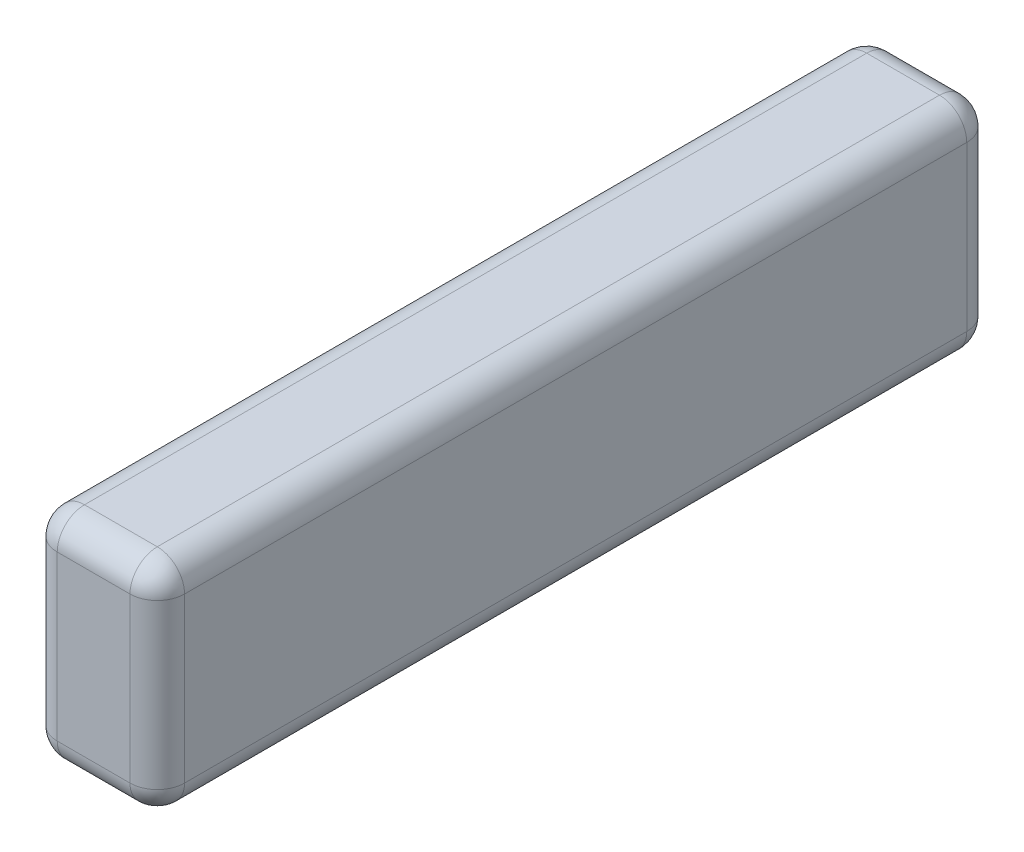
ISO-10303-21;
HEADER;
FILE_DESCRIPTION(('STEP AP214'),'2;1');
FILE_NAME('part.step','',(''),(''),'','','');
FILE_SCHEMA(('AUTOMOTIVE_DESIGN { 1 0 10303 214 1 1 1 1 }'));
ENDSEC;
DATA;
#1=APPLICATION_CONTEXT('core data for automotive mechanical design processes');
#2=APPLICATION_PROTOCOL_DEFINITION('international standard','automotive_design',2000,#1);
#3=PRODUCT_CONTEXT('',#1,'mechanical');
#4=PRODUCT('Part','Part','',(#3));
#5=PRODUCT_RELATED_PRODUCT_CATEGORY('part','',(#4));
#6=PRODUCT_DEFINITION_FORMATION('','',#4);
#7=PRODUCT_DEFINITION_CONTEXT('part definition',#1,'design');
#8=PRODUCT_DEFINITION('design','',#6,#7);
#9=PRODUCT_DEFINITION_SHAPE('','',#8);
#10=(LENGTH_UNIT() NAMED_UNIT(*) SI_UNIT(.MILLI.,.METRE.));
#11=(NAMED_UNIT(*) PLANE_ANGLE_UNIT() SI_UNIT($,.RADIAN.));
#12=(NAMED_UNIT(*) SI_UNIT($,.STERADIAN.) SOLID_ANGLE_UNIT());
#13=UNCERTAINTY_MEASURE_WITH_UNIT(LENGTH_MEASURE(1.E-05),#10,'distance_accuracy_value','');
#14=(GEOMETRIC_REPRESENTATION_CONTEXT(3) GLOBAL_UNCERTAINTY_ASSIGNED_CONTEXT((#13)) GLOBAL_UNIT_ASSIGNED_CONTEXT((#10,
#11,#12)) REPRESENTATION_CONTEXT('',''));
#15=CARTESIAN_POINT('',(0.,0.,0.));
#16=DIRECTION('',(0.,0.,1.));
#17=DIRECTION('',(1.,0.,0.));
#18=AXIS2_PLACEMENT_3D('',#15,#16,#17);
#19=CARTESIAN_POINT('',(10.6666666666666,12.,-23.820652173913));
#20=DIRECTION('',(1.,0.,0.));
#21=DIRECTION('',(0.,0.,-1.));
#22=AXIS2_PLACEMENT_3D('',#19,#20,#21);
#23=PLANE('',#22);
#24=DIRECTION('',(0.,0.,1.));
#25=VECTOR('',#24,1.);
#26=CARTESIAN_POINT('',(10.6666666666666,10.5,-23.820652173913));
#27=LINE('',#26,#25);
#28=CARTESIAN_POINT('',(10.6666666666667,10.5,20.679347826087));
#29=VERTEX_POINT('',#28);
#30=CARTESIAN_POINT('',(10.6666666666666,10.5,-22.320652173913));
#31=VERTEX_POINT('',#30);
#32=EDGE_CURVE('E194',#29,#31,#27,.F.);
#33=ORIENTED_EDGE('',*,*,#32,.T.);
#34=DIRECTION('',(0.,-1.,0.));
#35=VECTOR('',#34,1.);
#36=CARTESIAN_POINT('',(10.6666666666666,12.,-22.320652173913));
#37=LINE('',#36,#35);
#38=CARTESIAN_POINT('',(10.6666666666666,1.5,-22.320652173913));
#39=VERTEX_POINT('',#38);
#40=EDGE_CURVE('E200',#31,#39,#37,.T.);
#41=ORIENTED_EDGE('',*,*,#40,.T.);
#42=DIRECTION('',(0.,0.,1.));
#43=VECTOR('',#42,1.);
#44=CARTESIAN_POINT('',(10.6666666666666,1.5,-23.820652173913));
#45=LINE('',#44,#43);
#46=CARTESIAN_POINT('',(10.6666666666667,1.5,20.679347826087));
#47=VERTEX_POINT('',#46);
#48=EDGE_CURVE('E198',#39,#47,#45,.T.);
#49=ORIENTED_EDGE('',*,*,#48,.T.);
#50=DIRECTION('',(0.,-1.,0.));
#51=VECTOR('',#50,1.);
#52=CARTESIAN_POINT('',(10.6666666666667,12.,20.679347826087));
#53=LINE('',#52,#51);
#54=EDGE_CURVE('E196',#47,#29,#53,.F.);
#55=ORIENTED_EDGE('',*,*,#54,.T.);
#56=EDGE_LOOP('',(#33,#41,#49,#55));
#57=FACE_BOUND('',#56,.T.);
#58=ADVANCED_FACE('F39',(#57),#23,.F.);
#59=CARTESIAN_POINT('',(10.6666666666667,12.,22.179347826087));
#60=DIRECTION('',(0.,0.,-1.));
#61=DIRECTION('',(-1.,0.,0.));
#62=AXIS2_PLACEMENT_3D('',#59,#60,#61);
#63=PLANE('',#62);
#64=DIRECTION('',(0.,-1.,0.));
#65=VECTOR('',#64,1.);
#66=CARTESIAN_POINT('',(12.1666666666667,12.,22.179347826087));
#67=LINE('',#66,#65);
#68=CARTESIAN_POINT('',(12.1666666666667,10.5,22.179347826087));
#69=VERTEX_POINT('',#68);
#70=CARTESIAN_POINT('',(12.1666666666667,1.5,22.179347826087));
#71=VERTEX_POINT('',#70);
#72=EDGE_CURVE('E62',#69,#71,#67,.T.);
#73=ORIENTED_EDGE('',*,*,#72,.T.);
#74=DIRECTION('',(1.,0.,0.));
#75=VECTOR('',#74,1.);
#76=CARTESIAN_POINT('',(10.6666666666667,1.5,22.179347826087));
#77=LINE('',#76,#75);
#78=CARTESIAN_POINT('',(16.1666666666667,1.5,22.179347826087));
#79=VERTEX_POINT('',#78);
#80=EDGE_CURVE('E11',#71,#79,#77,.T.);
#81=ORIENTED_EDGE('',*,*,#80,.T.);
#82=DIRECTION('',(0.,-1.,0.));
#83=VECTOR('',#82,1.);
#84=CARTESIAN_POINT('',(16.1666666666667,12.,22.179347826087));
#85=LINE('',#84,#83);
#86=CARTESIAN_POINT('',(16.1666666666667,10.5,22.179347826087));
#87=VERTEX_POINT('',#86);
#88=EDGE_CURVE('E48',#79,#87,#85,.F.);
#89=ORIENTED_EDGE('',*,*,#88,.T.);
#90=DIRECTION('',(1.,0.,0.));
#91=VECTOR('',#90,1.);
#92=CARTESIAN_POINT('',(10.6666666666667,10.5,22.179347826087));
#93=LINE('',#92,#91);
#94=EDGE_CURVE('E203',#87,#69,#93,.F.);
#95=ORIENTED_EDGE('',*,*,#94,.T.);
#96=EDGE_LOOP('',(#73,#81,#89,#95));
#97=FACE_BOUND('',#96,.T.);
#98=ADVANCED_FACE('F293',(#97),#63,.F.);
#99=CARTESIAN_POINT('',(17.6666666666666,12.,-23.820652173913));
#100=DIRECTION('',(-1.,0.,0.));
#101=DIRECTION('',(0.,0.,1.));
#102=AXIS2_PLACEMENT_3D('',#99,#100,#101);
#103=PLANE('',#102);
#104=DIRECTION('',(0.,0.,-1.));
#105=VECTOR('',#104,1.);
#106=CARTESIAN_POINT('',(17.6666666666666,1.5,-23.820652173913));
#107=LINE('',#106,#105);
#108=CARTESIAN_POINT('',(17.6666666666667,1.5,20.679347826087));
#109=VERTEX_POINT('',#108);
#110=CARTESIAN_POINT('',(17.6666666666666,1.5,-22.320652173913));
#111=VERTEX_POINT('',#110);
#112=EDGE_CURVE('E180',#109,#111,#107,.T.);
#113=ORIENTED_EDGE('',*,*,#112,.T.);
#114=DIRECTION('',(0.,-1.,0.));
#115=VECTOR('',#114,1.);
#116=CARTESIAN_POINT('',(17.6666666666666,12.,-22.320652173913));
#117=LINE('',#116,#115);
#118=CARTESIAN_POINT('',(17.6666666666666,10.5,-22.320652173913));
#119=VERTEX_POINT('',#118);
#120=EDGE_CURVE('E182',#111,#119,#117,.F.);
#121=ORIENTED_EDGE('',*,*,#120,.T.);
#122=DIRECTION('',(0.,0.,-1.));
#123=VECTOR('',#122,1.);
#124=CARTESIAN_POINT('',(17.6666666666667,10.5,22.179347826087));
#125=LINE('',#124,#123);
#126=CARTESIAN_POINT('',(17.6666666666667,10.5,20.679347826087));
#127=VERTEX_POINT('',#126);
#128=EDGE_CURVE('E176',#119,#127,#125,.F.);
#129=ORIENTED_EDGE('',*,*,#128,.T.);
#130=DIRECTION('',(0.,-1.,0.));
#131=VECTOR('',#130,1.);
#132=CARTESIAN_POINT('',(17.6666666666667,12.,20.679347826087));
#133=LINE('',#132,#131);
#134=EDGE_CURVE('E178',#127,#109,#133,.T.);
#135=ORIENTED_EDGE('',*,*,#134,.T.);
#136=EDGE_LOOP('',(#113,#121,#129,#135));
#137=FACE_BOUND('',#136,.T.);
#138=ADVANCED_FACE('F275',(#137),#103,.F.);
#139=CARTESIAN_POINT('',(10.6666666666666,12.,-23.820652173913));
#140=DIRECTION('',(0.,0.,1.));
#141=DIRECTION('',(1.,0.,0.));
#142=AXIS2_PLACEMENT_3D('',#139,#140,#141);
#143=PLANE('',#142);
#144=DIRECTION('',(0.,-1.,0.));
#145=VECTOR('',#144,1.);
#146=CARTESIAN_POINT('',(12.1666666666666,12.,-23.820652173913));
#147=LINE('',#146,#145);
#148=CARTESIAN_POINT('',(12.1666666666666,1.5,-23.820652173913));
#149=VERTEX_POINT('',#148);
#150=CARTESIAN_POINT('',(12.1666666666666,10.5,-23.820652173913));
#151=VERTEX_POINT('',#150);
#152=EDGE_CURVE('E165',#149,#151,#147,.F.);
#153=ORIENTED_EDGE('',*,*,#152,.T.);
#154=DIRECTION('',(-1.,0.,0.));
#155=VECTOR('',#154,1.);
#156=CARTESIAN_POINT('',(17.6666666666666,10.5,-23.820652173913));
#157=LINE('',#156,#155);
#158=CARTESIAN_POINT('',(16.1666666666666,10.5,-23.820652173913));
#159=VERTEX_POINT('',#158);
#160=EDGE_CURVE('E137',#151,#159,#157,.F.);
#161=ORIENTED_EDGE('',*,*,#160,.T.);
#162=DIRECTION('',(0.,-1.,0.));
#163=VECTOR('',#162,1.);
#164=CARTESIAN_POINT('',(16.1666666666666,12.,-23.820652173913));
#165=LINE('',#164,#163);
#166=CARTESIAN_POINT('',(16.1666666666666,1.5,-23.820652173913));
#167=VERTEX_POINT('',#166);
#168=EDGE_CURVE('E173',#159,#167,#165,.T.);
#169=ORIENTED_EDGE('',*,*,#168,.T.);
#170=DIRECTION('',(-1.,0.,0.));
#171=VECTOR('',#170,1.);
#172=CARTESIAN_POINT('',(10.6666666666666,1.5,-23.820652173913));
#173=LINE('',#172,#171);
#174=EDGE_CURVE('E167',#167,#149,#173,.T.);
#175=ORIENTED_EDGE('',*,*,#174,.T.);
#176=EDGE_LOOP('',(#153,#161,#169,#175));
#177=FACE_BOUND('',#176,.T.);
#178=ADVANCED_FACE('F380',(#177),#143,.F.);
#179=CARTESIAN_POINT('',(0.,12.,0.));
#180=DIRECTION('',(0.,1.,0.));
#181=DIRECTION('',(0.,0.,1.));
#182=AXIS2_PLACEMENT_3D('',#179,#180,#181);
#183=PLANE('',#182);
#184=DIRECTION('',(0.,0.,-1.));
#185=VECTOR('',#184,1.);
#186=CARTESIAN_POINT('',(16.1666666666666,12.,-23.820652173913));
#187=LINE('',#186,#185);
#188=CARTESIAN_POINT('',(16.1666666666667,12.,20.679347826087));
#189=VERTEX_POINT('',#188);
#190=CARTESIAN_POINT('',(16.1666666666666,12.,-22.320652173913));
#191=VERTEX_POINT('',#190);
#192=EDGE_CURVE('E163',#189,#191,#187,.T.);
#193=ORIENTED_EDGE('',*,*,#192,.T.);
#194=DIRECTION('',(-1.,0.,0.));
#195=VECTOR('',#194,1.);
#196=CARTESIAN_POINT('',(10.6666666666666,12.,-22.320652173913));
#197=LINE('',#196,#195);
#198=CARTESIAN_POINT('',(12.1666666666666,12.,-22.320652173913));
#199=VERTEX_POINT('',#198);
#200=EDGE_CURVE('E135',#191,#199,#197,.T.);
#201=ORIENTED_EDGE('',*,*,#200,.T.);
#202=DIRECTION('',(0.,0.,1.));
#203=VECTOR('',#202,1.);
#204=CARTESIAN_POINT('',(12.1666666666667,12.,22.179347826087));
#205=LINE('',#204,#203);
#206=CARTESIAN_POINT('',(12.1666666666667,12.,20.679347826087));
#207=VERTEX_POINT('',#206);
#208=EDGE_CURVE('E153',#199,#207,#205,.T.);
#209=ORIENTED_EDGE('',*,*,#208,.T.);
#210=DIRECTION('',(1.,0.,0.));
#211=VECTOR('',#210,1.);
#212=CARTESIAN_POINT('',(17.6666666666667,12.,20.679347826087));
#213=LINE('',#212,#211);
#214=EDGE_CURVE('E159',#207,#189,#213,.T.);
#215=ORIENTED_EDGE('',*,*,#214,.T.);
#216=EDGE_LOOP('',(#193,#201,#209,#215));
#217=FACE_BOUND('',#216,.T.);
#218=ADVANCED_FACE('F161',(#217),#183,.T.);
#219=CARTESIAN_POINT('',(0.,0.,0.));
#220=DIRECTION('',(0.,1.,0.));
#221=DIRECTION('',(0.,0.,1.));
#222=AXIS2_PLACEMENT_3D('',#219,#220,#221);
#223=PLANE('',#222);
#224=DIRECTION('',(0.,0.,1.));
#225=VECTOR('',#224,1.);
#226=CARTESIAN_POINT('',(12.1666666666666,0.,0.));
#227=LINE('',#226,#225);
#228=CARTESIAN_POINT('',(12.1666666666667,0.,20.679347826087));
#229=VERTEX_POINT('',#228);
#230=CARTESIAN_POINT('',(12.1666666666666,0.,-22.320652173913));
#231=VERTEX_POINT('',#230);
#232=EDGE_CURVE('E189',#229,#231,#227,.F.);
#233=ORIENTED_EDGE('',*,*,#232,.T.);
#234=DIRECTION('',(-1.,0.,0.));
#235=VECTOR('',#234,1.);
#236=CARTESIAN_POINT('',(0.,0.,-22.320652173913));
#237=LINE('',#236,#235);
#238=CARTESIAN_POINT('',(16.1666666666666,0.,-22.320652173913));
#239=VERTEX_POINT('',#238);
#240=EDGE_CURVE('E191',#231,#239,#237,.F.);
#241=ORIENTED_EDGE('',*,*,#240,.T.);
#242=DIRECTION('',(0.,0.,-1.));
#243=VECTOR('',#242,1.);
#244=CARTESIAN_POINT('',(16.1666666666666,0.,0.));
#245=LINE('',#244,#243);
#246=CARTESIAN_POINT('',(16.1666666666667,0.,20.679347826087));
#247=VERTEX_POINT('',#246);
#248=EDGE_CURVE('E185',#239,#247,#245,.F.);
#249=ORIENTED_EDGE('',*,*,#248,.T.);
#250=DIRECTION('',(1.,0.,0.));
#251=VECTOR('',#250,1.);
#252=CARTESIAN_POINT('',(0.,0.,20.679347826087));
#253=LINE('',#252,#251);
#254=EDGE_CURVE('E187',#247,#229,#253,.F.);
#255=ORIENTED_EDGE('',*,*,#254,.T.);
#256=EDGE_LOOP('',(#233,#241,#249,#255));
#257=FACE_BOUND('',#256,.T.);
#258=ADVANCED_FACE('F360',(#257),#223,.F.);
#259=CARTESIAN_POINT('',(10.6666666666667,1.5,20.679347826087));
#260=DIRECTION('',(1.,0.,0.));
#261=DIRECTION('',(0.,0.,-1.));
#262=AXIS2_PLACEMENT_3D('',#259,#260,#261);
#263=CYLINDRICAL_SURFACE('',#262,1.5);
#264=CARTESIAN_POINT('',(16.1666666666667,1.5,20.679347826087));
#265=DIRECTION('',(1.,0.,0.));
#266=DIRECTION('',(0.,0.,-1.));
#267=AXIS2_PLACEMENT_3D('',#264,#265,#266);
#268=CIRCLE('',#267,1.5);
#269=EDGE_CURVE('E43',#79,#247,#268,.T.);
#270=ORIENTED_EDGE('',*,*,#269,.F.);
#271=ORIENTED_EDGE('',*,*,#80,.F.);
#272=CARTESIAN_POINT('',(12.1666666666667,1.5,20.679347826087));
#273=DIRECTION('',(-1.,0.,0.));
#274=DIRECTION('',(0.,0.,1.));
#275=AXIS2_PLACEMENT_3D('',#272,#273,#274);
#276=CIRCLE('',#275,1.5);
#277=EDGE_CURVE('E255',#229,#71,#276,.T.);
#278=ORIENTED_EDGE('',*,*,#277,.F.);
#279=ORIENTED_EDGE('',*,*,#254,.F.);
#280=EDGE_LOOP('',(#270,#271,#278,#279));
#281=FACE_BOUND('',#280,.T.);
#282=ADVANCED_FACE('F41',(#281),#263,.T.);
#283=CARTESIAN_POINT('',(16.1666666666667,1.5,20.679347826087));
#284=DIRECTION('',(0.,-1.,0.));
#285=DIRECTION('',(0.,0.,-1.));
#286=AXIS2_PLACEMENT_3D('',#283,#284,#285);
#287=SPHERICAL_SURFACE('',#286,1.5);
#288=CARTESIAN_POINT('',(16.1666666666667,1.5,20.679347826087));
#289=DIRECTION('',(0.,-1.,0.));
#290=DIRECTION('',(0.,0.,-1.));
#291=AXIS2_PLACEMENT_3D('',#288,#289,#290);
#292=CIRCLE('',#291,1.5);
#293=EDGE_CURVE('E251',#79,#109,#292,.F.);
#294=ORIENTED_EDGE('',*,*,#293,.F.);
#295=ORIENTED_EDGE('',*,*,#269,.T.);
#296=CARTESIAN_POINT('',(16.1666666666667,1.5,20.679347826087));
#297=DIRECTION('',(0.,0.,1.));
#298=DIRECTION('',(1.,0.,0.));
#299=AXIS2_PLACEMENT_3D('',#296,#297,#298);
#300=CIRCLE('',#299,1.5);
#301=EDGE_CURVE('E253',#109,#247,#300,.F.);
#302=ORIENTED_EDGE('',*,*,#301,.F.);
#303=EDGE_LOOP('',(#294,#295,#302));
#304=FACE_BOUND('',#303,.T.);
#305=ADVANCED_FACE('F265',(#304),#287,.T.);
#306=CARTESIAN_POINT('',(12.1666666666667,1.5,20.679347826087));
#307=DIRECTION('',(0.,0.,1.));
#308=DIRECTION('',(0.,-1.,0.));
#309=AXIS2_PLACEMENT_3D('',#306,#307,#308);
#310=SPHERICAL_SURFACE('',#309,1.5);
#311=CARTESIAN_POINT('',(12.1666666666667,1.5,20.679347826087));
#312=DIRECTION('',(0.,0.,1.));
#313=DIRECTION('',(1.,0.,0.));
#314=AXIS2_PLACEMENT_3D('',#311,#312,#313);
#315=CIRCLE('',#314,1.5);
#316=EDGE_CURVE('E245',#229,#47,#315,.F.);
#317=ORIENTED_EDGE('',*,*,#316,.F.);
#318=ORIENTED_EDGE('',*,*,#277,.T.);
#319=CARTESIAN_POINT('',(12.1666666666667,1.5,20.679347826087));
#320=DIRECTION('',(0.,-1.,0.));
#321=DIRECTION('',(0.,0.,-1.));
#322=AXIS2_PLACEMENT_3D('',#319,#320,#321);
#323=CIRCLE('',#322,1.5);
#324=EDGE_CURVE('E248',#47,#71,#323,.F.);
#325=ORIENTED_EDGE('',*,*,#324,.F.);
#326=EDGE_LOOP('',(#317,#318,#325));
#327=FACE_BOUND('',#326,.T.);
#328=ADVANCED_FACE('F290',(#327),#310,.T.);
#329=CARTESIAN_POINT('',(16.1666666666666,1.5,-23.820652173913));
#330=DIRECTION('',(0.,0.,-1.));
#331=DIRECTION('',(-1.,0.,0.));
#332=AXIS2_PLACEMENT_3D('',#329,#330,#331);
#333=CYLINDRICAL_SURFACE('',#332,1.5);
#334=ORIENTED_EDGE('',*,*,#301,.T.);
#335=ORIENTED_EDGE('',*,*,#248,.F.);
#336=CARTESIAN_POINT('',(16.1666666666666,1.5,-22.320652173913));
#337=DIRECTION('',(0.,0.,-1.));
#338=DIRECTION('',(-1.,0.,0.));
#339=AXIS2_PLACEMENT_3D('',#336,#337,#338);
#340=CIRCLE('',#339,1.5);
#341=EDGE_CURVE('E240',#111,#239,#340,.T.);
#342=ORIENTED_EDGE('',*,*,#341,.F.);
#343=ORIENTED_EDGE('',*,*,#112,.F.);
#344=EDGE_LOOP('',(#334,#335,#342,#343));
#345=FACE_BOUND('',#344,.T.);
#346=ADVANCED_FACE('F271',(#345),#333,.T.);
#347=CARTESIAN_POINT('',(16.1666666666667,12.,20.679347826087));
#348=DIRECTION('',(0.,-1.,0.));
#349=DIRECTION('',(0.,0.,-1.));
#350=AXIS2_PLACEMENT_3D('',#347,#348,#349);
#351=CYLINDRICAL_SURFACE('',#350,1.5);
#352=ORIENTED_EDGE('',*,*,#293,.T.);
#353=ORIENTED_EDGE('',*,*,#134,.F.);
#354=CARTESIAN_POINT('',(16.1666666666667,10.5,20.679347826087));
#355=DIRECTION('',(0.,1.,0.));
#356=DIRECTION('',(0.,0.,1.));
#357=AXIS2_PLACEMENT_3D('',#354,#355,#356);
#358=CIRCLE('',#357,1.5);
#359=EDGE_CURVE('E237',#87,#127,#358,.T.);
#360=ORIENTED_EDGE('',*,*,#359,.F.);
#361=ORIENTED_EDGE('',*,*,#88,.F.);
#362=EDGE_LOOP('',(#352,#353,#360,#361));
#363=FACE_BOUND('',#362,.T.);
#364=ADVANCED_FACE('F279',(#363),#351,.T.);
#365=CARTESIAN_POINT('',(0.,10.5,20.679347826087));
#366=DIRECTION('',(-1.,0.,0.));
#367=DIRECTION('',(0.,0.,1.));
#368=AXIS2_PLACEMENT_3D('',#365,#366,#367);
#369=CYLINDRICAL_SURFACE('',#368,1.5);
#370=CARTESIAN_POINT('',(12.1666666666667,10.5,20.679347826087));
#371=DIRECTION('',(-1.,0.,0.));
#372=DIRECTION('',(0.,0.,1.));
#373=AXIS2_PLACEMENT_3D('',#370,#371,#372);
#374=CIRCLE('',#373,1.5);
#375=EDGE_CURVE('E231',#69,#207,#374,.T.);
#376=ORIENTED_EDGE('',*,*,#375,.F.);
#377=ORIENTED_EDGE('',*,*,#94,.F.);
#378=CARTESIAN_POINT('',(16.1666666666667,10.5,20.679347826087));
#379=DIRECTION('',(1.,0.,0.));
#380=DIRECTION('',(0.,0.,-1.));
#381=AXIS2_PLACEMENT_3D('',#378,#379,#380);
#382=CIRCLE('',#381,1.5);
#383=EDGE_CURVE('E234',#189,#87,#382,.T.);
#384=ORIENTED_EDGE('',*,*,#383,.F.);
#385=ORIENTED_EDGE('',*,*,#214,.F.);
#386=EDGE_LOOP('',(#376,#377,#384,#385));
#387=FACE_BOUND('',#386,.T.);
#388=ADVANCED_FACE('F281',(#387),#369,.T.);
#389=CARTESIAN_POINT('',(12.1666666666667,12.,20.679347826087));
#390=DIRECTION('',(0.,-1.,0.));
#391=DIRECTION('',(0.,0.,-1.));
#392=AXIS2_PLACEMENT_3D('',#389,#390,#391);
#393=CYLINDRICAL_SURFACE('',#392,1.5);
#394=ORIENTED_EDGE('',*,*,#324,.T.);
#395=ORIENTED_EDGE('',*,*,#72,.F.);
#396=CARTESIAN_POINT('',(12.1666666666667,10.5,20.679347826087));
#397=DIRECTION('',(0.,1.,0.));
#398=DIRECTION('',(0.,0.,1.));
#399=AXIS2_PLACEMENT_3D('',#396,#397,#398);
#400=CIRCLE('',#399,1.5);
#401=EDGE_CURVE('E228',#29,#69,#400,.T.);
#402=ORIENTED_EDGE('',*,*,#401,.F.);
#403=ORIENTED_EDGE('',*,*,#54,.F.);
#404=EDGE_LOOP('',(#394,#395,#402,#403));
#405=FACE_BOUND('',#404,.T.);
#406=ADVANCED_FACE('F287',(#405),#393,.T.);
#407=CARTESIAN_POINT('',(12.1666666666666,1.5,-23.820652173913));
#408=DIRECTION('',(0.,0.,1.));
#409=DIRECTION('',(1.,0.,0.));
#410=AXIS2_PLACEMENT_3D('',#407,#408,#409);
#411=CYLINDRICAL_SURFACE('',#410,1.5);
#412=ORIENTED_EDGE('',*,*,#316,.T.);
#413=ORIENTED_EDGE('',*,*,#48,.F.);
#414=CARTESIAN_POINT('',(12.1666666666666,1.5,-22.320652173913));
#415=DIRECTION('',(0.,0.,-1.));
#416=DIRECTION('',(-1.,0.,0.));
#417=AXIS2_PLACEMENT_3D('',#414,#415,#416);
#418=CIRCLE('',#417,1.5);
#419=EDGE_CURVE('E225',#231,#39,#418,.T.);
#420=ORIENTED_EDGE('',*,*,#419,.F.);
#421=ORIENTED_EDGE('',*,*,#232,.F.);
#422=EDGE_LOOP('',(#412,#413,#420,#421));
#423=FACE_BOUND('',#422,.T.);
#424=ADVANCED_FACE('F343',(#423),#411,.T.);
#425=CARTESIAN_POINT('',(10.6666666666666,1.5,-22.320652173913));
#426=DIRECTION('',(-1.,0.,0.));
#427=DIRECTION('',(0.,0.,1.));
#428=AXIS2_PLACEMENT_3D('',#425,#426,#427);
#429=CYLINDRICAL_SURFACE('',#428,1.5);
#430=CARTESIAN_POINT('',(16.1666666666666,1.5,-22.320652173913));
#431=DIRECTION('',(1.,0.,0.));
#432=DIRECTION('',(0.,0.,-1.));
#433=AXIS2_PLACEMENT_3D('',#430,#431,#432);
#434=CIRCLE('',#433,1.5);
#435=EDGE_CURVE('E242',#239,#167,#434,.T.);
#436=ORIENTED_EDGE('',*,*,#435,.F.);
#437=ORIENTED_EDGE('',*,*,#240,.F.);
#438=CARTESIAN_POINT('',(12.1666666666666,1.5,-22.320652173913));
#439=DIRECTION('',(-1.,0.,0.));
#440=DIRECTION('',(0.,0.,1.));
#441=AXIS2_PLACEMENT_3D('',#438,#439,#440);
#442=CIRCLE('',#441,1.5);
#443=EDGE_CURVE('E222',#149,#231,#442,.T.);
#444=ORIENTED_EDGE('',*,*,#443,.F.);
#445=ORIENTED_EDGE('',*,*,#174,.F.);
#446=EDGE_LOOP('',(#436,#437,#444,#445));
#447=FACE_BOUND('',#446,.T.);
#448=ADVANCED_FACE('F339',(#447),#429,.T.);
#449=CARTESIAN_POINT('',(16.1666666666666,1.5,-22.320652173913));
#450=DIRECTION('',(0.,-1.,0.));
#451=DIRECTION('',(0.,0.,-1.));
#452=AXIS2_PLACEMENT_3D('',#449,#450,#451);
#453=SPHERICAL_SURFACE('',#452,1.5);
#454=ORIENTED_EDGE('',*,*,#341,.T.);
#455=ORIENTED_EDGE('',*,*,#435,.T.);
#456=CARTESIAN_POINT('',(16.1666666666666,1.5,-22.320652173913));
#457=DIRECTION('',(0.,-1.,0.));
#458=DIRECTION('',(0.,0.,-1.));
#459=AXIS2_PLACEMENT_3D('',#456,#457,#458);
#460=CIRCLE('',#459,1.5);
#461=EDGE_CURVE('E219',#111,#167,#460,.F.);
#462=ORIENTED_EDGE('',*,*,#461,.F.);
#463=EDGE_LOOP('',(#454,#455,#462));
#464=FACE_BOUND('',#463,.T.);
#465=ADVANCED_FACE('F335',(#464),#453,.T.);
#466=CARTESIAN_POINT('',(16.1666666666667,10.5,20.679347826087));
#467=DIRECTION('',(0.,0.,1.));
#468=DIRECTION('',(1.,0.,0.));
#469=AXIS2_PLACEMENT_3D('',#466,#467,#468);
#470=SPHERICAL_SURFACE('',#469,1.5);
#471=ORIENTED_EDGE('',*,*,#383,.T.);
#472=ORIENTED_EDGE('',*,*,#359,.T.);
#473=CARTESIAN_POINT('',(16.1666666666667,10.5,20.679347826087));
#474=DIRECTION('',(0.,0.,1.));
#475=DIRECTION('',(1.,0.,0.));
#476=AXIS2_PLACEMENT_3D('',#473,#474,#475);
#477=CIRCLE('',#476,1.5);
#478=EDGE_CURVE('E216',#189,#127,#477,.F.);
#479=ORIENTED_EDGE('',*,*,#478,.F.);
#480=EDGE_LOOP('',(#471,#472,#479));
#481=FACE_BOUND('',#480,.T.);
#482=ADVANCED_FACE('F331',(#481),#470,.T.);
#483=CARTESIAN_POINT('',(12.1666666666667,10.5,20.679347826087));
#484=DIRECTION('',(0.,0.,1.));
#485=DIRECTION('',(1.,0.,0.));
#486=AXIS2_PLACEMENT_3D('',#483,#484,#485);
#487=SPHERICAL_SURFACE('',#486,1.5);
#488=ORIENTED_EDGE('',*,*,#401,.T.);
#489=ORIENTED_EDGE('',*,*,#375,.T.);
#490=CARTESIAN_POINT('',(12.1666666666667,10.5,20.679347826087));
#491=DIRECTION('',(0.,0.,1.));
#492=DIRECTION('',(1.,0.,0.));
#493=AXIS2_PLACEMENT_3D('',#490,#491,#492);
#494=CIRCLE('',#493,1.5);
#495=EDGE_CURVE('E156',#29,#207,#494,.F.);
#496=ORIENTED_EDGE('',*,*,#495,.F.);
#497=EDGE_LOOP('',(#488,#489,#496));
#498=FACE_BOUND('',#497,.T.);
#499=ADVANCED_FACE('F327',(#498),#487,.T.);
#500=CARTESIAN_POINT('',(12.1666666666666,1.5,-22.320652173913));
#501=DIRECTION('',(0.,-1.,0.));
#502=DIRECTION('',(0.,0.,-1.));
#503=AXIS2_PLACEMENT_3D('',#500,#501,#502);
#504=SPHERICAL_SURFACE('',#503,1.5);
#505=ORIENTED_EDGE('',*,*,#443,.T.);
#506=ORIENTED_EDGE('',*,*,#419,.T.);
#507=CARTESIAN_POINT('',(12.1666666666666,1.5,-22.320652173913));
#508=DIRECTION('',(0.,-1.,0.));
#509=DIRECTION('',(0.,0.,-1.));
#510=AXIS2_PLACEMENT_3D('',#507,#508,#509);
#511=CIRCLE('',#510,1.5);
#512=EDGE_CURVE('E213',#149,#39,#511,.F.);
#513=ORIENTED_EDGE('',*,*,#512,.F.);
#514=EDGE_LOOP('',(#505,#506,#513));
#515=FACE_BOUND('',#514,.T.);
#516=ADVANCED_FACE('F323',(#515),#504,.T.);
#517=CARTESIAN_POINT('',(16.1666666666666,12.,-22.320652173913));
#518=DIRECTION('',(0.,-1.,0.));
#519=DIRECTION('',(0.,0.,-1.));
#520=AXIS2_PLACEMENT_3D('',#517,#518,#519);
#521=CYLINDRICAL_SURFACE('',#520,1.5);
#522=ORIENTED_EDGE('',*,*,#461,.T.);
#523=ORIENTED_EDGE('',*,*,#168,.F.);
#524=CARTESIAN_POINT('',(16.1666666666666,10.5,-22.320652173913));
#525=DIRECTION('',(0.,1.,0.));
#526=DIRECTION('',(0.,0.,1.));
#527=AXIS2_PLACEMENT_3D('',#524,#525,#526);
#528=CIRCLE('',#527,1.5);
#529=EDGE_CURVE('E210',#119,#159,#528,.T.);
#530=ORIENTED_EDGE('',*,*,#529,.F.);
#531=ORIENTED_EDGE('',*,*,#120,.F.);
#532=EDGE_LOOP('',(#522,#523,#530,#531));
#533=FACE_BOUND('',#532,.T.);
#534=ADVANCED_FACE('F319',(#533),#521,.T.);
#535=CARTESIAN_POINT('',(16.1666666666666,10.5,0.));
#536=DIRECTION('',(0.,0.,1.));
#537=DIRECTION('',(1.,0.,0.));
#538=AXIS2_PLACEMENT_3D('',#535,#536,#537);
#539=CYLINDRICAL_SURFACE('',#538,1.5);
#540=ORIENTED_EDGE('',*,*,#478,.T.);
#541=ORIENTED_EDGE('',*,*,#128,.F.);
#542=CARTESIAN_POINT('',(16.1666666666666,10.5,-22.320652173913));
#543=DIRECTION('',(0.,0.,-1.));
#544=DIRECTION('',(-1.,0.,0.));
#545=AXIS2_PLACEMENT_3D('',#542,#543,#544);
#546=CIRCLE('',#545,1.5);
#547=EDGE_CURVE('E150',#191,#119,#546,.T.);
#548=ORIENTED_EDGE('',*,*,#547,.F.);
#549=ORIENTED_EDGE('',*,*,#192,.F.);
#550=EDGE_LOOP('',(#540,#541,#548,#549));
#551=FACE_BOUND('',#550,.T.);
#552=ADVANCED_FACE('F316',(#551),#539,.T.);
#553=CARTESIAN_POINT('',(12.1666666666666,10.5,0.));
#554=DIRECTION('',(0.,0.,-1.));
#555=DIRECTION('',(-1.,0.,0.));
#556=AXIS2_PLACEMENT_3D('',#553,#554,#555);
#557=CYLINDRICAL_SURFACE('',#556,1.5);
#558=ORIENTED_EDGE('',*,*,#495,.T.);
#559=ORIENTED_EDGE('',*,*,#208,.F.);
#560=CARTESIAN_POINT('',(12.1666666666666,10.5,-22.320652173913));
#561=DIRECTION('',(0.,0.,-1.));
#562=DIRECTION('',(-1.,0.,0.));
#563=AXIS2_PLACEMENT_3D('',#560,#561,#562);
#564=CIRCLE('',#563,1.5);
#565=EDGE_CURVE('E143',#31,#199,#564,.T.);
#566=ORIENTED_EDGE('',*,*,#565,.F.);
#567=ORIENTED_EDGE('',*,*,#32,.F.);
#568=EDGE_LOOP('',(#558,#559,#566,#567));
#569=FACE_BOUND('',#568,.T.);
#570=ADVANCED_FACE('F154',(#569),#557,.T.);
#571=CARTESIAN_POINT('',(12.1666666666666,12.,-22.320652173913));
#572=DIRECTION('',(0.,-1.,0.));
#573=DIRECTION('',(0.,0.,-1.));
#574=AXIS2_PLACEMENT_3D('',#571,#572,#573);
#575=CYLINDRICAL_SURFACE('',#574,1.5);
#576=ORIENTED_EDGE('',*,*,#512,.T.);
#577=ORIENTED_EDGE('',*,*,#40,.F.);
#578=CARTESIAN_POINT('',(12.1666666666666,10.5,-22.320652173913));
#579=DIRECTION('',(0.,1.,0.));
#580=DIRECTION('',(0.,0.,1.));
#581=AXIS2_PLACEMENT_3D('',#578,#579,#580);
#582=CIRCLE('',#581,1.5);
#583=EDGE_CURVE('E147',#151,#31,#582,.T.);
#584=ORIENTED_EDGE('',*,*,#583,.F.);
#585=ORIENTED_EDGE('',*,*,#152,.F.);
#586=EDGE_LOOP('',(#576,#577,#584,#585));
#587=FACE_BOUND('',#586,.T.);
#588=ADVANCED_FACE('F309',(#587),#575,.T.);
#589=CARTESIAN_POINT('',(16.1666666666666,10.5,-22.320652173913));
#590=DIRECTION('',(1.,0.,0.));
#591=DIRECTION('',(0.,0.,-1.));
#592=AXIS2_PLACEMENT_3D('',#589,#590,#591);
#593=SPHERICAL_SURFACE('',#592,1.5);
#594=ORIENTED_EDGE('',*,*,#547,.T.);
#595=ORIENTED_EDGE('',*,*,#529,.T.);
#596=CARTESIAN_POINT('',(16.1666666666666,10.5,-22.320652173913));
#597=DIRECTION('',(1.,0.,0.));
#598=DIRECTION('',(0.,0.,-1.));
#599=AXIS2_PLACEMENT_3D('',#596,#597,#598);
#600=CIRCLE('',#599,1.5);
#601=EDGE_CURVE('E140',#191,#159,#600,.F.);
#602=ORIENTED_EDGE('',*,*,#601,.F.);
#603=EDGE_LOOP('',(#594,#595,#602));
#604=FACE_BOUND('',#603,.T.);
#605=ADVANCED_FACE('F306',(#604),#593,.T.);
#606=CARTESIAN_POINT('',(12.1666666666666,10.5,-22.320652173913));
#607=DIRECTION('',(-1.,0.,0.));
#608=DIRECTION('',(0.,0.,1.));
#609=AXIS2_PLACEMENT_3D('',#606,#607,#608);
#610=SPHERICAL_SURFACE('',#609,1.5);
#611=ORIENTED_EDGE('',*,*,#583,.T.);
#612=ORIENTED_EDGE('',*,*,#565,.T.);
#613=CARTESIAN_POINT('',(12.1666666666666,10.5,-22.320652173913));
#614=DIRECTION('',(-1.,0.,0.));
#615=DIRECTION('',(0.,0.,1.));
#616=AXIS2_PLACEMENT_3D('',#613,#614,#615);
#617=CIRCLE('',#616,1.5);
#618=EDGE_CURVE('E131',#151,#199,#617,.F.);
#619=ORIENTED_EDGE('',*,*,#618,.F.);
#620=EDGE_LOOP('',(#611,#612,#619));
#621=FACE_BOUND('',#620,.T.);
#622=ADVANCED_FACE('F145',(#621),#610,.T.);
#623=CARTESIAN_POINT('',(0.,10.5,-22.320652173913));
#624=DIRECTION('',(1.,0.,0.));
#625=DIRECTION('',(0.,0.,-1.));
#626=AXIS2_PLACEMENT_3D('',#623,#624,#625);
#627=CYLINDRICAL_SURFACE('',#626,1.5);
#628=ORIENTED_EDGE('',*,*,#601,.T.);
#629=ORIENTED_EDGE('',*,*,#160,.F.);
#630=ORIENTED_EDGE('',*,*,#618,.T.);
#631=ORIENTED_EDGE('',*,*,#200,.F.);
#632=EDGE_LOOP('',(#628,#629,#630,#631));
#633=FACE_BOUND('',#632,.T.);
#634=ADVANCED_FACE('F133',(#633),#627,.T.);
#635=CLOSED_SHELL('',(#58,#98,#138,#178,#218,#258,#282,#305,#328,#346,#364,#388,#406,#424,#448,
#465,#482,#499,#516,#534,#552,#570,#588,#605,#622,#634));
#636=MANIFOLD_SOLID_BREP('B2',#635);
#637=ADVANCED_BREP_SHAPE_REPRESENTATION('',(#18,#636),#14);
#638=SHAPE_DEFINITION_REPRESENTATION(#9,#637);
ENDSEC;
END-ISO-10303-21;
